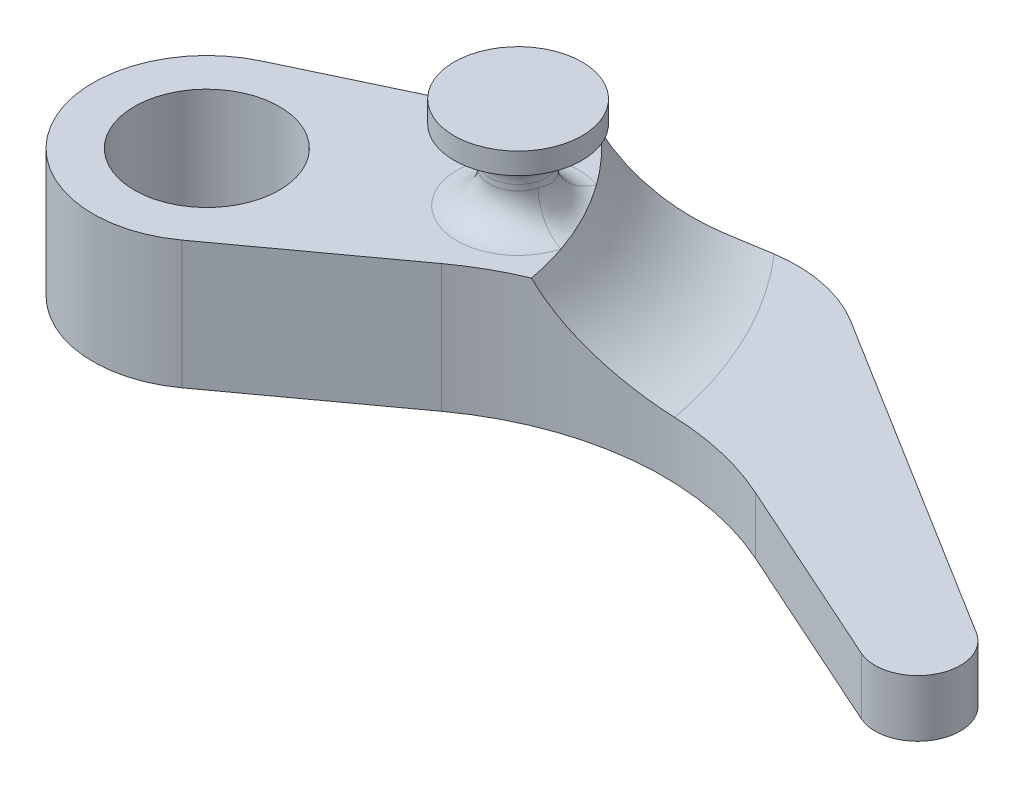
ISO-10303-21;
HEADER;
FILE_DESCRIPTION(('STEP AP214'),'2;1');
FILE_NAME('part.step','',(''),(''),'','','');
FILE_SCHEMA(('AUTOMOTIVE_DESIGN { 1 0 10303 214 1 1 1 1 }'));
ENDSEC;
DATA;
#1=APPLICATION_CONTEXT('core data for automotive mechanical design processes');
#2=APPLICATION_PROTOCOL_DEFINITION('international standard','automotive_design',2000,#1);
#3=PRODUCT_CONTEXT('',#1,'mechanical');
#4=PRODUCT('Part','Part','',(#3));
#5=PRODUCT_RELATED_PRODUCT_CATEGORY('part','',(#4));
#6=PRODUCT_DEFINITION_FORMATION('','',#4);
#7=PRODUCT_DEFINITION_CONTEXT('part definition',#1,'design');
#8=PRODUCT_DEFINITION('design','',#6,#7);
#9=PRODUCT_DEFINITION_SHAPE('','',#8);
#10=(LENGTH_UNIT() NAMED_UNIT(*) SI_UNIT(.MILLI.,.METRE.));
#11=(NAMED_UNIT(*) PLANE_ANGLE_UNIT() SI_UNIT($,.RADIAN.));
#12=(NAMED_UNIT(*) SI_UNIT($,.STERADIAN.) SOLID_ANGLE_UNIT());
#13=UNCERTAINTY_MEASURE_WITH_UNIT(LENGTH_MEASURE(1.E-05),#10,'distance_accuracy_value','');
#14=(GEOMETRIC_REPRESENTATION_CONTEXT(3) GLOBAL_UNCERTAINTY_ASSIGNED_CONTEXT((#13)) GLOBAL_UNIT_ASSIGNED_CONTEXT((#10,
#11,#12)) REPRESENTATION_CONTEXT('',''));
#15=CARTESIAN_POINT('',(0.,0.,0.));
#16=DIRECTION('',(0.,0.,1.));
#17=DIRECTION('',(1.,0.,0.));
#18=AXIS2_PLACEMENT_3D('',#15,#16,#17);
#19=CARTESIAN_POINT('',(50.,9.,0.));
#20=DIRECTION('',(0.,1.,0.));
#21=DIRECTION('',(0.,0.,1.));
#22=AXIS2_PLACEMENT_3D('',#19,#20,#21);
#23=PLANE('',#22);
#24=CARTESIAN_POINT('',(0.,9.,0.));
#25=DIRECTION('',(0.,1.,0.));
#26=DIRECTION('',(0.,0.,1.));
#27=AXIS2_PLACEMENT_3D('',#24,#25,#26);
#28=CIRCLE('',#27,5.1);
#29=CARTESIAN_POINT('',(0.,9.,5.1));
#30=VERTEX_POINT('',#29);
#31=EDGE_CURVE('E256',#30,#30,#28,.T.);
#32=ORIENTED_EDGE('',*,*,#31,.F.);
#33=EDGE_LOOP('',(#32));
#34=FACE_BOUND('',#33,.T.);
#35=CARTESIAN_POINT('',(0.,9.,0.));
#36=DIRECTION('',(0.,-1.,0.));
#37=DIRECTION('',(0.,0.,1.));
#38=AXIS2_PLACEMENT_3D('',#35,#36,#37);
#39=CIRCLE('',#38,19.6351341922937);
#40=CARTESIAN_POINT('',(18.5841220242283,9.,-6.33789423530991));
#41=VERTEX_POINT('',#40);
#42=CARTESIAN_POINT('',(19.3172991097876,9.,-3.51858634289096));
#43=VERTEX_POINT('',#42);
#44=EDGE_CURVE('E142',#41,#43,#39,.T.);
#45=ORIENTED_EDGE('',*,*,#44,.F.);
#46=CARTESIAN_POINT('',(14.4328784205439,9.,-7.45913307822854));
#47=DIRECTION('',(0.,1.,0.));
#48=DIRECTION('',(0.,0.,1.));
#49=AXIS2_PLACEMENT_3D('',#46,#47,#48);
#50=CIRCLE('',#49,4.3);
#51=CARTESIAN_POINT('',(15.9193516618392,9.,-11.4940305122302));
#52=VERTEX_POINT('',#51);
#53=EDGE_CURVE('E52',#41,#52,#50,.F.);
#54=ORIENTED_EDGE('',*,*,#53,.T.);
#55=CARTESIAN_POINT('',(12.7819439780485,9.,-14.9050462223843));
#56=VERTEX_POINT('',#55);
#57=EDGE_CURVE('E132',#56,#52,#39,.T.);
#58=ORIENTED_EDGE('',*,*,#57,.F.);
#59=DIRECTION('',(-0.903774156343791,0.,0.428009666158451));
#60=VECTOR('',#59,1.);
#61=CARTESIAN_POINT('',(-3.42407732926761,9.,-7.23019325075033));
#62=LINE('',#61,#60);
#63=CARTESIAN_POINT('',(-3.4240773292676,9.,-7.23019325075033));
#64=VERTEX_POINT('',#63);
#65=EDGE_CURVE('E134',#56,#64,#62,.T.);
#66=ORIENTED_EDGE('',*,*,#65,.T.);
#67=CARTESIAN_POINT('',(0.,9.,0.));
#68=DIRECTION('',(0.,1.,0.));
#69=DIRECTION('',(0.,0.,1.));
#70=AXIS2_PLACEMENT_3D('',#67,#68,#69);
#71=CIRCLE('',#70,8.);
#72=CARTESIAN_POINT('',(4.71284242711324,9.,6.46445018986158));
#73=VERTEX_POINT('',#72);
#74=EDGE_CURVE('E152',#64,#73,#71,.T.);
#75=ORIENTED_EDGE('',*,*,#74,.T.);
#76=DIRECTION('',(0.808056273732698,0.,-0.589105303389155));
#77=VECTOR('',#76,1.);
#78=CARTESIAN_POINT('',(4.71284242711324,9.,6.46445018986158));
#79=LINE('',#78,#77);
#80=CARTESIAN_POINT('',(15.2822849376401,9.,-1.24109562324827));
#81=VERTEX_POINT('',#80);
#82=EDGE_CURVE('E269',#73,#81,#79,.T.);
#83=ORIENTED_EDGE('',*,*,#82,.T.);
#84=CARTESIAN_POINT('',(27.0643910054231,9.,14.9200298514057));
#85=DIRECTION('',(0.,1.,0.));
#86=DIRECTION('',(0.,0.,1.));
#87=AXIS2_PLACEMENT_3D('',#84,#85,#86);
#88=CIRCLE('',#87,20.);
#89=EDGE_CURVE('E299',#81,#43,#88,.F.);
#90=ORIENTED_EDGE('',*,*,#89,.T.);
#91=EDGE_LOOP('',(#45,#54,#58,#66,#75,#83,#90));
#92=FACE_BOUND('',#91,.T.);
#93=ADVANCED_FACE('F37',(#34,#92),#23,.T.);
#94=CARTESIAN_POINT('',(24.6603959558355,9.,-8.078113187719));
#95=DIRECTION('',(0.409264418009091,0.,-0.912415824145811));
#96=DIRECTION('',(-0.912415824145811,0.,-0.409264418009091));
#97=AXIS2_PLACEMENT_3D('',#94,#95,#96);
#98=PLANE('',#97);
#99=DIRECTION('',(0.912415824145811,0.,0.409264418009091));
#100=VECTOR('',#99,1.);
#101=CARTESIAN_POINT('',(24.6603959558355,4.,-8.078113187719));
#102=LINE('',#101,#100);
#103=CARTESIAN_POINT('',(35.249679365605,4.,-3.32828663151053));
#104=VERTEX_POINT('',#103);
#105=CARTESIAN_POINT('',(48.7722067459727,4.,2.73724747243743));
#106=VERTEX_POINT('',#105);
#107=EDGE_CURVE('E139',#104,#106,#102,.T.);
#108=ORIENTED_EDGE('',*,*,#107,.F.);
#109=DIRECTION('',(0.,-1.,0.));
#110=VECTOR('',#109,1.);
#111=CARTESIAN_POINT('',(35.249679365605,0.,-3.32828663151053));
#112=LINE('',#111,#110);
#113=CARTESIAN_POINT('',(35.249679365605,0.,-3.32828663151054));
#114=VERTEX_POINT('',#113);
#115=EDGE_CURVE('E292',#104,#114,#112,.T.);
#116=ORIENTED_EDGE('',*,*,#115,.T.);
#117=DIRECTION('',(0.912415824145811,0.,0.409264418009091));
#118=VECTOR('',#117,1.);
#119=CARTESIAN_POINT('',(24.6603959558355,0.,-8.078113187719));
#120=LINE('',#119,#118);
#121=CARTESIAN_POINT('',(48.7722067459727,0.,2.73724747243744));
#122=VERTEX_POINT('',#121);
#123=EDGE_CURVE('E257',#114,#122,#120,.T.);
#124=ORIENTED_EDGE('',*,*,#123,.T.);
#125=DIRECTION('',(0.,-1.,0.));
#126=VECTOR('',#125,1.);
#127=CARTESIAN_POINT('',(48.7722067459727,9.,2.73724747243744));
#128=LINE('',#127,#126);
#129=EDGE_CURVE('E289',#106,#122,#128,.T.);
#130=ORIENTED_EDGE('',*,*,#129,.F.);
#131=EDGE_LOOP('',(#108,#116,#124,#130));
#132=FACE_BOUND('',#131,.T.);
#133=ADVANCED_FACE('F247',(#132),#98,.F.);
#134=CARTESIAN_POINT('',(50.,9.,0.));
#135=DIRECTION('',(0.,-1.,0.));
#136=DIRECTION('',(0.,0.,-1.));
#137=AXIS2_PLACEMENT_3D('',#134,#135,#136);
#138=CYLINDRICAL_SURFACE('',#137,3.);
#139=CARTESIAN_POINT('',(50.,4.,0.));
#140=DIRECTION('',(0.,1.,0.));
#141=DIRECTION('',(0.,0.,1.));
#142=AXIS2_PLACEMENT_3D('',#139,#140,#141);
#143=CIRCLE('',#142,3.);
#144=CARTESIAN_POINT('',(51.585093155393,4.,-2.54705313818267));
#145=VERTEX_POINT('',#144);
#146=EDGE_CURVE('E333',#106,#145,#143,.T.);
#147=ORIENTED_EDGE('',*,*,#146,.F.);
#148=ORIENTED_EDGE('',*,*,#129,.T.);
#149=CARTESIAN_POINT('',(50.,0.,0.));
#150=DIRECTION('',(0.,1.,0.));
#151=DIRECTION('',(0.,0.,1.));
#152=AXIS2_PLACEMENT_3D('',#149,#150,#151);
#153=CIRCLE('',#152,3.);
#154=CARTESIAN_POINT('',(51.585093155393,0.,-2.54705313818268));
#155=VERTEX_POINT('',#154);
#156=EDGE_CURVE('E260',#122,#155,#153,.T.);
#157=ORIENTED_EDGE('',*,*,#156,.T.);
#158=DIRECTION('',(0.,-1.,0.));
#159=VECTOR('',#158,1.);
#160=CARTESIAN_POINT('',(51.585093155393,9.,-2.54705313818268));
#161=LINE('',#160,#159);
#162=EDGE_CURVE('E287',#145,#155,#161,.T.);
#163=ORIENTED_EDGE('',*,*,#162,.F.);
#164=EDGE_LOOP('',(#147,#148,#157,#163));
#165=FACE_BOUND('',#164,.T.);
#166=ADVANCED_FACE('F252',(#165),#138,.T.);
#167=CARTESIAN_POINT('',(23.5403167814108,9.,-20.));
#168=DIRECTION('',(-0.528364385131008,0.,0.849017712727557));
#169=DIRECTION('',(0.849017712727557,0.,0.528364385131008));
#170=AXIS2_PLACEMENT_3D('',#167,#168,#169);
#171=PLANE('',#170);
#172=DIRECTION('',(-0.849017712727557,0.,-0.528364385131008));
#173=VECTOR('',#172,1.);
#174=CARTESIAN_POINT('',(23.5403167814108,0.,-20.));
#175=LINE('',#174,#173);
#176=CARTESIAN_POINT('',(28.17280352365,0.,-17.1170907597117));
#177=VERTEX_POINT('',#176);
#178=EDGE_CURVE('E275',#155,#177,#175,.T.);
#179=ORIENTED_EDGE('',*,*,#178,.T.);
#180=DIRECTION('',(0.,-1.,0.));
#181=VECTOR('',#180,1.);
#182=CARTESIAN_POINT('',(28.17280352365,9.,-17.1170907597117));
#183=LINE('',#182,#181);
#184=CARTESIAN_POINT('',(28.17280352365,4.,-17.1170907597117));
#185=VERTEX_POINT('',#184);
#186=EDGE_CURVE('E308',#177,#185,#183,.F.);
#187=ORIENTED_EDGE('',*,*,#186,.T.);
#188=DIRECTION('',(-0.849017712727557,0.,-0.528364385131008));
#189=VECTOR('',#188,1.);
#190=CARTESIAN_POINT('',(23.5403167814108,4.,-20.));
#191=LINE('',#190,#189);
#192=EDGE_CURVE('E263',#145,#185,#191,.T.);
#193=ORIENTED_EDGE('',*,*,#192,.F.);
#194=ORIENTED_EDGE('',*,*,#162,.T.);
#195=EDGE_LOOP('',(#179,#187,#193,#194));
#196=FACE_BOUND('',#195,.T.);
#197=ADVANCED_FACE('F398',(#196),#171,.F.);
#198=CARTESIAN_POINT('',(50.,0.,0.));
#199=DIRECTION('',(0.,1.,0.));
#200=DIRECTION('',(0.,0.,1.));
#201=AXIS2_PLACEMENT_3D('',#198,#199,#200);
#202=PLANE('',#201);
#203=DIRECTION('',(-0.903774156343791,0.,0.428009666158451));
#204=VECTOR('',#203,1.);
#205=CARTESIAN_POINT('',(-3.42407732926761,0.,-7.23019325075033));
#206=LINE('',#205,#204);
#207=CARTESIAN_POINT('',(18.6090630107554,0.,-17.664655195874));
#208=VERTEX_POINT('',#207);
#209=CARTESIAN_POINT('',(-3.4240773292676,0.,-7.23019325075033));
#210=VERTEX_POINT('',#209);
#211=EDGE_CURVE('E278',#208,#210,#206,.T.);
#212=ORIENTED_EDGE('',*,*,#211,.F.);
#213=CARTESIAN_POINT('',(22.8891596723399,0.,-8.6269136324361));
#214=DIRECTION('',(0.,1.,0.));
#215=DIRECTION('',(0.,0.,1.));
#216=AXIS2_PLACEMENT_3D('',#213,#214,#215);
#217=CIRCLE('',#216,10.);
#218=EDGE_CURVE('E306',#208,#177,#217,.F.);
#219=ORIENTED_EDGE('',*,*,#218,.T.);
#220=ORIENTED_EDGE('',*,*,#178,.F.);
#221=ORIENTED_EDGE('',*,*,#156,.F.);
#222=ORIENTED_EDGE('',*,*,#123,.F.);
#223=CARTESIAN_POINT('',(27.0643910054231,0.,14.9200298514057));
#224=DIRECTION('',(0.,1.,0.));
#225=DIRECTION('',(0.,0.,1.));
#226=AXIS2_PLACEMENT_3D('',#223,#224,#225);
#227=CIRCLE('',#226,20.);
#228=CARTESIAN_POINT('',(15.2822849376401,0.,-1.24109562324827));
#229=VERTEX_POINT('',#228);
#230=EDGE_CURVE('E297',#114,#229,#227,.T.);
#231=ORIENTED_EDGE('',*,*,#230,.T.);
#232=DIRECTION('',(0.808056273732698,0.,-0.589105303389155));
#233=VECTOR('',#232,1.);
#234=CARTESIAN_POINT('',(4.71284242711324,0.,6.46445018986158));
#235=LINE('',#234,#233);
#236=CARTESIAN_POINT('',(4.71284242711324,0.,6.46445018986158));
#237=VERTEX_POINT('',#236);
#238=EDGE_CURVE('E153',#237,#229,#235,.T.);
#239=ORIENTED_EDGE('',*,*,#238,.F.);
#240=CARTESIAN_POINT('',(0.,0.,0.));
#241=DIRECTION('',(0.,1.,0.));
#242=DIRECTION('',(0.,0.,1.));
#243=AXIS2_PLACEMENT_3D('',#240,#241,#242);
#244=CIRCLE('',#243,8.);
#245=EDGE_CURVE('E280',#210,#237,#244,.T.);
#246=ORIENTED_EDGE('',*,*,#245,.F.);
#247=EDGE_LOOP('',(#212,#219,#220,#221,#222,#231,#239,#246));
#248=FACE_BOUND('',#247,.T.);
#249=CARTESIAN_POINT('',(0.,0.,0.));
#250=DIRECTION('',(0.,1.,0.));
#251=DIRECTION('',(0.,0.,1.));
#252=AXIS2_PLACEMENT_3D('',#249,#250,#251);
#253=CIRCLE('',#252,5.1);
#254=CARTESIAN_POINT('',(0.,0.,5.1));
#255=VERTEX_POINT('',#254);
#256=EDGE_CURVE('E258',#255,#255,#253,.T.);
#257=ORIENTED_EDGE('',*,*,#256,.T.);
#258=EDGE_LOOP('',(#257));
#259=FACE_BOUND('',#258,.T.);
#260=ADVANCED_FACE('F326',(#248,#259),#202,.F.);
#261=CARTESIAN_POINT('',(-3.42407732926761,9.,-7.23019325075033));
#262=DIRECTION('',(0.428009666158451,0.,0.903774156343791));
#263=DIRECTION('',(0.903774156343791,0.,-0.428009666158451));
#264=AXIS2_PLACEMENT_3D('',#261,#262,#263);
#265=PLANE('',#264);
#266=ORIENTED_EDGE('',*,*,#65,.F.);
#267=CARTESIAN_POINT('',(12.7819439780485,9.,-14.9050462223843));
#268=CARTESIAN_POINT('',(12.9265925091345,8.74680657867576,-14.9735489219424));
#269=CARTESIAN_POINT('',(13.0814721341331,8.50084613002611,-15.0468968663654));
#270=CARTESIAN_POINT('',(13.4099345318748,8.02486186234918,-15.2024501981532));
#271=CARTESIAN_POINT('',(13.5835099647121,7.79483184694503,-15.2846521094831));
#272=CARTESIAN_POINT('',(13.9476720807586,7.35203807927803,-15.4571121257632));
#273=CARTESIAN_POINT('',(14.1382542044342,7.13926972815401,-15.5473680714081));
#274=CARTESIAN_POINT('',(14.5348232287598,6.73208729753039,-15.7351753621111));
#275=CARTESIAN_POINT('',(14.7408111082856,6.537674386107,-15.8327271707457));
#276=CARTESIAN_POINT('',(15.1662789420027,6.16851803264646,-16.0342203692314));
#277=CARTESIAN_POINT('',(15.3857414395889,5.99374993841039,-16.1381534919776));
#278=CARTESIAN_POINT('',(15.8368150176805,5.66454365185223,-16.3517730674177));
#279=CARTESIAN_POINT('',(16.0684273161736,5.51010750322512,-16.4614600969266));
#280=CARTESIAN_POINT('',(16.5418116484501,5.22268860207377,-16.685645606769));
#281=CARTESIAN_POINT('',(16.7835677549537,5.0896736950131,-16.800136544256));
#282=CARTESIAN_POINT('',(17.2758825613222,4.84566103030158,-17.0332871543278));
#283=CARTESIAN_POINT('',(17.5264369579603,4.73465268108636,-17.1519447889889));
#284=CARTESIAN_POINT('',(17.9168400373539,4.58155710376218,-17.3368320094362));
#285=CARTESIAN_POINT('',(18.0541400905092,4.5313824957229,-17.4018546143669));
#286=CARTESIAN_POINT('',(18.3303824878247,4.4377100471281,-17.5326775809497));
#287=CARTESIAN_POINT('',(18.4693223270281,4.39420316225841,-17.5984767563036));
#288=CARTESIAN_POINT('',(18.6090630107554,4.35403577340383,-17.664655195874));
#289=B_SPLINE_CURVE_WITH_KNOTS('',3,(#267,#268,#269,#270,#271,#272,#273,#274,#275,#276,#277,
#278,#279,#280,#281,#282,#283,#284,#285,#286,#287,#288),.UNSPECIFIED.,.F.,.F.,(4,2,2,2,2,2,2,2,
2,2,4),(0.,0.898219489125047,1.79608761712054,2.6937157436815,3.59140095372184,4.4879467804026,
5.38458265599361,6.27985982457269,7.1747050523287,7.65454258345187,8.13372337440446),.UNSPECIFIED.);
#290=CARTESIAN_POINT('',(18.6090630107554,4.35403577340383,-17.664655195874));
#291=VERTEX_POINT('',#290);
#292=EDGE_CURVE('E147',#56,#291,#289,.T.);
#293=ORIENTED_EDGE('',*,*,#292,.T.);
#294=DIRECTION('',(0.,-1.,0.));
#295=VECTOR('',#294,1.);
#296=CARTESIAN_POINT('',(18.6090630107554,9.,-17.664655195874));
#297=LINE('',#296,#295);
#298=EDGE_CURVE('E304',#291,#208,#297,.T.);
#299=ORIENTED_EDGE('',*,*,#298,.T.);
#300=ORIENTED_EDGE('',*,*,#211,.T.);
#301=DIRECTION('',(0.,-1.,0.));
#302=VECTOR('',#301,1.);
#303=CARTESIAN_POINT('',(-3.4240773292676,9.,-7.23019325075033));
#304=LINE('',#303,#302);
#305=EDGE_CURVE('E150',#64,#210,#304,.T.);
#306=ORIENTED_EDGE('',*,*,#305,.F.);
#307=EDGE_LOOP('',(#266,#293,#299,#300,#306));
#308=FACE_BOUND('',#307,.T.);
#309=ADVANCED_FACE('F145',(#308),#265,.F.);
#310=CARTESIAN_POINT('',(0.,9.,0.));
#311=DIRECTION('',(0.,-1.,0.));
#312=DIRECTION('',(0.,0.,-1.));
#313=AXIS2_PLACEMENT_3D('',#310,#311,#312);
#314=CYLINDRICAL_SURFACE('',#313,8.);
#315=ORIENTED_EDGE('',*,*,#245,.T.);
#316=DIRECTION('',(0.,-1.,0.));
#317=VECTOR('',#316,1.);
#318=CARTESIAN_POINT('',(4.71284242711324,9.,6.46445018986158));
#319=LINE('',#318,#317);
#320=EDGE_CURVE('E271',#73,#237,#319,.T.);
#321=ORIENTED_EDGE('',*,*,#320,.F.);
#322=ORIENTED_EDGE('',*,*,#74,.F.);
#323=ORIENTED_EDGE('',*,*,#305,.T.);
#324=EDGE_LOOP('',(#315,#321,#322,#323));
#325=FACE_BOUND('',#324,.T.);
#326=ADVANCED_FACE('F241',(#325),#314,.T.);
#327=CARTESIAN_POINT('',(4.71284242711324,9.,6.46445018986158));
#328=DIRECTION('',(-0.589105303389154,0.,-0.808056273732698));
#329=DIRECTION('',(-0.808056273732698,0.,0.589105303389154));
#330=AXIS2_PLACEMENT_3D('',#327,#328,#329);
#331=PLANE('',#330);
#332=ORIENTED_EDGE('',*,*,#238,.T.);
#333=DIRECTION('',(0.,-1.,0.));
#334=VECTOR('',#333,1.);
#335=CARTESIAN_POINT('',(15.2822849376401,4.,-1.24109562324826));
#336=LINE('',#335,#334);
#337=EDGE_CURVE('E295',#229,#81,#336,.F.);
#338=ORIENTED_EDGE('',*,*,#337,.T.);
#339=ORIENTED_EDGE('',*,*,#82,.F.);
#340=ORIENTED_EDGE('',*,*,#320,.T.);
#341=EDGE_LOOP('',(#332,#338,#339,#340));
#342=FACE_BOUND('',#341,.T.);
#343=ADVANCED_FACE('F236',(#342),#331,.F.);
#344=CARTESIAN_POINT('',(0.,9.,0.));
#345=DIRECTION('',(0.,-1.,0.));
#346=DIRECTION('',(0.,0.,-1.));
#347=AXIS2_PLACEMENT_3D('',#344,#345,#346);
#348=CYLINDRICAL_SURFACE('',#347,5.1);
#349=ORIENTED_EDGE('',*,*,#31,.T.);
#350=EDGE_LOOP('',(#349));
#351=FACE_BOUND('',#350,.T.);
#352=ORIENTED_EDGE('',*,*,#256,.F.);
#353=EDGE_LOOP('',(#352));
#354=FACE_BOUND('',#353,.T.);
#355=ADVANCED_FACE('F233',(#351,#354),#348,.F.);
#356=CARTESIAN_POINT('',(0.,4.,0.));
#357=DIRECTION('',(0.,1.,0.));
#358=DIRECTION('',(0.,0.,1.));
#359=AXIS2_PLACEMENT_3D('',#356,#357,#358);
#360=PLANE('',#359);
#361=CARTESIAN_POINT('',(22.8891596723399,4.,-8.6269136324361));
#362=DIRECTION('',(0.,1.,0.));
#363=DIRECTION('',(0.,0.,1.));
#364=AXIS2_PLACEMENT_3D('',#361,#362,#363);
#365=CIRCLE('',#364,10.);
#366=CARTESIAN_POINT('',(21.3968686502042,4.,-18.5149401041469));
#367=VERTEX_POINT('',#366);
#368=EDGE_CURVE('E310',#185,#367,#365,.T.);
#369=ORIENTED_EDGE('',*,*,#368,.T.);
#370=CARTESIAN_POINT('',(0.,4.,0.));
#371=DIRECTION('',(0.,1.,0.));
#372=DIRECTION('',(0.,0.,1.));
#373=AXIS2_PLACEMENT_3D('',#370,#371,#372);
#374=CIRCLE('',#373,28.2953882301381);
#375=CARTESIAN_POINT('',(27.8383707748396,4.,-5.06498842020303));
#376=VERTEX_POINT('',#375);
#377=EDGE_CURVE('E163',#367,#376,#374,.F.);
#378=ORIENTED_EDGE('',*,*,#377,.T.);
#379=CARTESIAN_POINT('',(27.0643910054231,4.,14.9200298514057));
#380=DIRECTION('',(0.,1.,0.));
#381=DIRECTION('',(0.,0.,1.));
#382=AXIS2_PLACEMENT_3D('',#379,#380,#381);
#383=CIRCLE('',#382,20.);
#384=EDGE_CURVE('E302',#376,#104,#383,.F.);
#385=ORIENTED_EDGE('',*,*,#384,.T.);
#386=ORIENTED_EDGE('',*,*,#107,.T.);
#387=ORIENTED_EDGE('',*,*,#146,.T.);
#388=ORIENTED_EDGE('',*,*,#192,.T.);
#389=EDGE_LOOP('',(#369,#378,#385,#386,#387,#388));
#390=FACE_BOUND('',#389,.T.);
#391=ADVANCED_FACE('F229',(#390),#360,.T.);
#392=CARTESIAN_POINT('',(27.0643910054231,9.,14.9200298514057));
#393=DIRECTION('',(0.,1.,0.));
#394=DIRECTION('',(0.,0.,1.));
#395=AXIS2_PLACEMENT_3D('',#392,#393,#394);
#396=CYLINDRICAL_SURFACE('',#395,20.);
#397=ORIENTED_EDGE('',*,*,#89,.F.);
#398=ORIENTED_EDGE('',*,*,#337,.F.);
#399=ORIENTED_EDGE('',*,*,#230,.F.);
#400=ORIENTED_EDGE('',*,*,#115,.F.);
#401=ORIENTED_EDGE('',*,*,#384,.F.);
#402=CARTESIAN_POINT('',(27.8383707748396,4.,-5.06498842020303));
#403=CARTESIAN_POINT('',(27.5808998367106,3.99996603360385,-5.07500345163974));
#404=CARTESIAN_POINT('',(27.3232140492119,4.00948834518667,-5.07995788059808));
#405=CARTESIAN_POINT('',(26.8092771047482,4.04783021143104,-5.07998224431851));
#406=CARTESIAN_POINT('',(26.5530259873394,4.07665029554742,-5.07505190787417));
#407=CARTESIAN_POINT('',(26.044509276921,4.15367059953575,-5.05556868368567));
#408=CARTESIAN_POINT('',(25.7922349470479,4.20181944721716,-5.04104123767649));
#409=CARTESIAN_POINT('',(25.2928604530678,4.31741269371456,-5.00293059873405));
#410=CARTESIAN_POINT('',(25.0457599841434,4.38485595235047,-4.97934794087951));
#411=CARTESIAN_POINT('',(24.5583138989335,4.53881447881014,-4.92385614303385));
#412=CARTESIAN_POINT('',(24.3179739239407,4.62534517122231,-4.8919402651));
#413=CARTESIAN_POINT('',(23.8459224068755,4.81694776459398,-4.82075137542927));
#414=CARTESIAN_POINT('',(23.6142113048258,4.92202060953272,-4.78147798911607));
#415=CARTESIAN_POINT('',(23.1608616884651,5.15005304552729,-4.69668917167735));
#416=CARTESIAN_POINT('',(22.9392267070492,5.27301884770336,-4.65117157333551));
#417=CARTESIAN_POINT('',(22.5074408020999,5.53596136411259,-4.55516276709521));
#418=CARTESIAN_POINT('',(22.2972896551093,5.67593774717563,-4.50467165602709));
#419=CARTESIAN_POINT('',(21.8870311369127,5.973803462128,-4.39939978665707));
#420=CARTESIAN_POINT('',(21.6870827737466,6.13189542262884,-4.3445731735217));
#421=CARTESIAN_POINT('',(21.3010751460209,6.46347281046126,-4.23263530955442));
#422=CARTESIAN_POINT('',(21.1150162766293,6.63695867545546,-4.1755239937917));
#423=CARTESIAN_POINT('',(20.7577017227526,6.99810006852257,-4.06050978668469));
#424=CARTESIAN_POINT('',(20.5864378920357,7.18574769102308,-4.00260735154055));
#425=CARTESIAN_POINT('',(20.2593259575074,7.57410062882385,-3.8874459660291));
#426=CARTESIAN_POINT('',(20.1034723253035,7.77480121823625,-3.83018679147498));
#427=CARTESIAN_POINT('',(19.8390385567136,8.14436295302218,-3.72963087423642));
#428=CARTESIAN_POINT('',(19.7274364530427,8.31096701676984,-3.68594498833865));
#429=CARTESIAN_POINT('',(19.5146103169917,8.65067789162205,-3.60060455546759));
#430=CARTESIAN_POINT('',(19.4133654031153,8.82377061726934,-3.55894601375224));
#431=CARTESIAN_POINT('',(19.3172991097876,9.,-3.51858634289096));
#432=B_SPLINE_CURVE_WITH_KNOTS('',3,(#402,#403,#404,#405,#406,#407,#408,#409,#410,#411,#412,
#413,#414,#415,#416,#417,#418,#419,#420,#421,#422,#423,#424,#425,#426,#427,#428,#429,#430,#431),
.UNSPECIFIED.,.F.,.F.,(4,2,2,2,2,2,2,2,2,2,2,2,2,2,4),(0.,0.772798593524394,1.54561839046614,
2.31639763580591,3.08713134227539,3.85849017669146,4.62988829224822,5.40155482218855,
6.17320633136232,6.95453497965837,7.73588584895619,8.5168037229209,9.29744041913782,
9.9127764383449,10.5268463379039),.UNSPECIFIED.);
#433=EDGE_CURVE('E158',#376,#43,#432,.T.);
#434=ORIENTED_EDGE('',*,*,#433,.T.);
#435=EDGE_LOOP('',(#397,#398,#399,#400,#401,#434));
#436=FACE_BOUND('',#435,.T.);
#437=ADVANCED_FACE('F232',(#436),#396,.F.);
#438=CARTESIAN_POINT('',(22.8891596723399,9.,-8.6269136324361));
#439=DIRECTION('',(0.,-1.,0.));
#440=DIRECTION('',(0.,0.,-1.));
#441=AXIS2_PLACEMENT_3D('',#438,#439,#440);
#442=CYLINDRICAL_SURFACE('',#441,10.);
#443=ORIENTED_EDGE('',*,*,#368,.F.);
#444=ORIENTED_EDGE('',*,*,#186,.F.);
#445=ORIENTED_EDGE('',*,*,#218,.F.);
#446=ORIENTED_EDGE('',*,*,#298,.F.);
#447=CARTESIAN_POINT('',(18.6090630107554,4.35403577340383,-17.664655195874));
#448=CARTESIAN_POINT('',(18.7172604148511,4.32293290297612,-17.7158985690146));
#449=CARTESIAN_POINT('',(18.8268754078138,4.29401647120803,-17.7654273343536));
#450=CARTESIAN_POINT('',(19.048698868768,4.24046932456896,-17.8608418038729));
#451=CARTESIAN_POINT('',(19.1609071778616,4.21583834790385,-17.9067277304973));
#452=CARTESIAN_POINT('',(19.4989185175716,4.14866706111049,-18.0377717562231));
#453=CARTESIAN_POINT('',(19.72817940507,4.11225977768138,-18.1173000481181));
#454=CARTESIAN_POINT('',(20.1936341650621,4.05498805814757,-18.2598464922441));
#455=CARTESIAN_POINT('',(20.429827817393,4.03412312902011,-18.3228651681396));
#456=CARTESIAN_POINT('',(20.7887394525936,4.01348345135883,-18.4046182928999));
#457=CARTESIAN_POINT('',(20.9097336748928,4.0083814181134,-18.4298291433468));
#458=CARTESIAN_POINT('',(21.1526563744483,4.00163982935273,-18.4757631687628));
#459=CARTESIAN_POINT('',(21.2745847674128,3.9999999650482,-18.496486743802));
#460=CARTESIAN_POINT('',(21.3968686502042,4.,-18.5149401041469));
#461=B_SPLINE_CURVE_WITH_KNOTS('',3,(#447,#448,#449,#450,#451,#452,#453,#454,#455,#456,#457,
#458,#459,#460),.UNSPECIFIED.,.F.,.F.,(4,2,2,2,2,2,4),(0.,0.371000650368669,0.741978628718646,
1.47686394521826,2.21172594925165,2.58270389447987,2.95364875095426),.UNSPECIFIED.);
#462=EDGE_CURVE('E157',#291,#367,#461,.T.);
#463=ORIENTED_EDGE('',*,*,#462,.T.);
#464=EDGE_LOOP('',(#443,#444,#445,#446,#463));
#465=FACE_BOUND('',#464,.T.);
#466=ADVANCED_FACE('F190',(#465),#442,.T.);
#467=CARTESIAN_POINT('',(0.,14.,0.));
#468=DIRECTION('',(0.,1.,0.));
#469=DIRECTION('',(0.,0.,1.));
#470=AXIS2_PLACEMENT_3D('',#467,#468,#469);
#471=TOROIDAL_SURFACE('',#470,28.2953882301381,10.);
#472=ORIENTED_EDGE('',*,*,#292,.F.);
#473=ORIENTED_EDGE('',*,*,#57,.T.);
#474=EDGE_CURVE('E140',#52,#41,#39,.T.);
#475=ORIENTED_EDGE('',*,*,#474,.T.);
#476=ORIENTED_EDGE('',*,*,#44,.T.);
#477=ORIENTED_EDGE('',*,*,#433,.F.);
#478=ORIENTED_EDGE('',*,*,#377,.F.);
#479=ORIENTED_EDGE('',*,*,#462,.F.);
#480=EDGE_LOOP('',(#472,#473,#475,#476,#477,#478,#479));
#481=FACE_BOUND('',#480,.T.);
#482=ADVANCED_FACE('F155',(#481),#471,.F.);
#483=CARTESIAN_POINT('',(14.4328784205439,14.,-7.45913307822854));
#484=DIRECTION('',(0.,-1.,0.));
#485=DIRECTION('',(0.,0.,-1.));
#486=AXIS2_PLACEMENT_3D('',#483,#484,#485);
#487=CYLINDRICAL_SURFACE('',#486,2.);
#488=CARTESIAN_POINT('',(14.4328784205439,11.3,-7.45913307822854));
#489=DIRECTION('',(0.,1.,0.));
#490=DIRECTION('',(0.,0.,1.));
#491=AXIS2_PLACEMENT_3D('',#488,#489,#490);
#492=CIRCLE('',#491,2.);
#493=CARTESIAN_POINT('',(15.1242613234719,11.3,-9.33582955915954));
#494=VERTEX_POINT('',#493);
#495=CARTESIAN_POINT('',(16.3636893990017,11.3,-6.93762663966174));
#496=VERTEX_POINT('',#495);
#497=EDGE_CURVE('E221',#494,#496,#492,.T.);
#498=ORIENTED_EDGE('',*,*,#497,.T.);
#499=CARTESIAN_POINT('',(15.2898631633714,9.,-12.3190332086069));
#500=CARTESIAN_POINT('',(15.4160186902241,8.27231661608342,-9.42424299453832));
#501=CARTESIAN_POINT('',(14.5065697489936,11.117844147949,-9.45777501417188));
#502=CARTESIAN_POINT('',(15.3174939127558,9.,-12.2847401022045));
#503=CARTESIAN_POINT('',(15.3741593265836,8.303551263891,-9.41227659073421));
#504=CARTESIAN_POINT('',(14.5363658474353,11.1383471584292,-9.45668044209487));
#505=CARTESIAN_POINT('',(15.3457836506777,9.,-12.2493908965778));
#506=CARTESIAN_POINT('',(15.3360779476099,8.33733059889801,-9.40250176000281));
#507=CARTESIAN_POINT('',(14.566431356877,11.1567558167778,-9.45490051852947));
#508=CARTESIAN_POINT('',(15.4034729229387,9.,-12.1767671963456));
#509=CARTESIAN_POINT('',(15.2685979666997,8.40783758655986,-9.38652242177463));
#510=CARTESIAN_POINT('',(14.6268729454606,11.1897106303993,-9.44993216421952));
#511=CARTESIAN_POINT('',(15.4328713740004,9.,-12.1394945685567));
#512=CARTESIAN_POINT('',(15.2391001985273,8.4444884557279,-9.38027170687262));
#513=CARTESIAN_POINT('',(14.65724870134,11.204260449749,-9.44674507733624));
#514=CARTESIAN_POINT('',(15.5221701896226,9.,-12.0253905767233));
#515=CARTESIAN_POINT('',(15.1647392117697,8.55514065705248,-9.36546576892768));
#516=CARTESIAN_POINT('',(14.7482505063996,11.2425211544443,-9.43505451743723));
#517=CARTESIAN_POINT('',(15.5834820304472,9.,-11.9458923594275));
#518=CARTESIAN_POINT('',(15.1317851899548,8.63159408863293,-9.36033304512264));
#519=CARTESIAN_POINT('',(14.8090832828756,11.2610610816465,-9.42441048349465));
#520=CARTESIAN_POINT('',(15.7412772105504,9.,-11.737779657367));
#521=CARTESIAN_POINT('',(15.0890523997537,8.81652151465585,-9.34985220946852));
#522=CARTESIAN_POINT('',(14.9616052799432,11.2939265859096,-9.39028224028649));
#523=CARTESIAN_POINT('',(15.8393724909057,9.,-11.6052367568168));
#524=CARTESIAN_POINT('',(15.0973276011656,8.92331781119273,-9.34552332668701));
#525=CARTESIAN_POINT('',(15.0527791028576,11.3009669222312,-9.36299335573767));
#526=CARTESIAN_POINT('',(16.0380524785741,9.,-11.3290990140929));
#527=CARTESIAN_POINT('',(15.1619323883736,9.10947885210101,-9.32222607321736));
#528=CARTESIAN_POINT('',(15.230456709726,11.2988203583348,-9.29569439473214));
#529=CARTESIAN_POINT('',(16.1386446774154,9.,-11.185467224913));
#530=CARTESIAN_POINT('',(15.216654152925,9.19017934538268,-9.30374074062384));
#531=CARTESIAN_POINT('',(15.3169430899171,11.2895767551958,-9.25564026592754));
#532=CARTESIAN_POINT('',(16.3418432802835,9.,-10.8865035389625));
#533=CARTESIAN_POINT('',(15.3508046207327,9.32536940655105,-9.24412894416736));
#534=CARTESIAN_POINT('',(15.48470623651,11.2625572348373,-9.16295782619375));
#535=CARTESIAN_POINT('',(16.4444514097161,9.,-10.7310004027136));
#536=CARTESIAN_POINT('',(15.4303218630045,9.38071994613126,-9.20313923530565));
#537=CARTESIAN_POINT('',(15.5658517209032,11.2446215042765,-9.11010366578747));
#538=CARTESIAN_POINT('',(16.6482161944769,9.,-10.4120677253872));
#539=CARTESIAN_POINT('',(15.5954701398249,9.46864027588573,-9.09726277500707));
#540=CARTESIAN_POINT('',(15.7196087789709,11.2073543022276,-8.99328952282804));
#541=CARTESIAN_POINT('',(16.7493734412311,9.,-10.2486415402813));
#542=CARTESIAN_POINT('',(15.6815369372669,9.50212274681382,-9.03261896245485));
#543=CARTESIAN_POINT('',(15.7922239219968,11.1880234200184,-8.92933421328368));
#544=CARTESIAN_POINT('',(16.9072426036579,9.,-9.9848131985208));
#545=CARTESIAN_POINT('',(15.8133348995236,9.54215773458108,-8.91326010780493));
#546=CARTESIAN_POINT('',(15.8992934176744,11.161010040438,-8.82030835185322));
#547=CARTESIAN_POINT('',(16.9648905733219,9.,-9.8865618339264));
#548=CARTESIAN_POINT('',(15.8608390685995,9.55416793629918,-8.86585424009193));
#549=CARTESIAN_POINT('',(15.9370296269551,11.1518324369874,-8.77849046743129));
#550=CARTESIAN_POINT('',(17.0790050135107,9.,-9.68809403230416));
#551=CARTESIAN_POINT('',(15.9521587478638,9.57361343890613,-8.76478838801432));
#552=CARTESIAN_POINT('',(16.0088818096398,11.135913230319,-8.69176465252724));
#553=CARTESIAN_POINT('',(17.1354718529105,9.,-9.58787822831249));
#554=CARTESIAN_POINT('',(15.9961315629845,9.58111157097312,-8.7110343268119));
#555=CARTESIAN_POINT('',(16.0429989272835,11.1291708555297,-8.64685770615325));
#556=CARTESIAN_POINT('',(17.2469594532049,9.,-9.38585088531022));
#557=CARTESIAN_POINT('',(16.0789804907387,9.59221764858151,-8.59832890325331));
#558=CARTESIAN_POINT('',(16.1073453984457,11.1188039902606,-8.55427617657296));
#559=CARTESIAN_POINT('',(17.3019804171059,9.,-9.28403957355387));
#560=CARTESIAN_POINT('',(16.1180006305374,9.59585986462643,-8.5392382109173));
#561=CARTESIAN_POINT('',(16.1375753000892,11.1151790597883,-8.5066019849469));
#562=CARTESIAN_POINT('',(17.4103258493976,9.,-9.0792328106943));
#563=CARTESIAN_POINT('',(16.1898984860064,9.59963168439842,-8.41713464021758));
#564=CARTESIAN_POINT('',(16.1939073014581,11.1114086033952,-8.4088484277349));
#565=CARTESIAN_POINT('',(17.4636504278585,9.,-8.97623743701196));
#566=CARTESIAN_POINT('',(16.2228923256155,9.59977267495062,-8.35394837161091));
#567=CARTESIAN_POINT('',(16.2200096694375,11.1112628512656,-8.35876921873036));
#568=CARTESIAN_POINT('',(17.566297071887,9.,-8.77360139465295));
#569=CARTESIAN_POINT('',(16.2808427825626,9.59663900947675,-8.2276514499241));
#570=CARTESIAN_POINT('',(16.2669314475096,11.1144044809272,-8.25862303443747));
#571=CARTESIAN_POINT('',(17.6156940267855,9.,-8.67398914445196));
#572=CARTESIAN_POINT('',(16.3061379651344,9.59349068126809,-8.16445809144527));
#573=CARTESIAN_POINT('',(16.287918963447,11.1175563163714,-8.20863390227366));
#574=CARTESIAN_POINT('',(17.7125363204162,9.,-8.47448366072012));
#575=CARTESIAN_POINT('',(16.3500986889739,9.58372083080547,-8.0371838069904));
#576=CARTESIAN_POINT('',(16.3257576168109,11.1267781410298,-8.10716494859499));
#577=CARTESIAN_POINT('',(17.7599809573466,9.,-8.37459033970267));
#578=CARTESIAN_POINT('',(16.3687944405936,9.57707084307839,-7.97292711194495));
#579=CARTESIAN_POINT('',(16.342607277426,11.1328491698318,-8.05568460216905));
#580=CARTESIAN_POINT('',(17.8992364673717,9.,-8.07491440811105));
#581=CARTESIAN_POINT('',(16.4148922269734,9.55102597996525,-7.78036596416907));
#582=CARTESIAN_POINT('',(16.3867979720231,11.1546749234111,-7.89946657500079));
#583=CARTESIAN_POINT('',(17.9879555217766,9.,-7.87516236019531));
#584=CARTESIAN_POINT('',(16.431929496775,9.5253908460704,-7.65257406253432));
#585=CARTESIAN_POINT('',(16.407774555532,11.1740416622044,-7.79296510693973));
#586=CARTESIAN_POINT('',(18.1573195704131,9.,-7.47648501125885));
#587=CARTESIAN_POINT('',(16.4427143826475,9.45139525815116,-7.41221054885314));
#588=CARTESIAN_POINT('',(16.4324118353369,11.2156740970402,-7.57686731144137));
#589=CARTESIAN_POINT('',(18.2378545179111,9.,-7.27759860640108));
#590=CARTESIAN_POINT('',(16.4356330430633,9.40181961671753,-7.29905903437126));
#591=CARTESIAN_POINT('',(16.4358610525958,11.2379718829459,-7.46724916186147));
#592=CARTESIAN_POINT('',(18.3892767043475,9.,-6.88598985940342));
#593=CARTESIAN_POINT('',(16.4090110805604,9.27196492958879,-7.1067316262342));
#594=CARTESIAN_POINT('',(16.4247842032303,11.2756287813047,-7.24886175924144));
#595=CARTESIAN_POINT('',(18.4601883129776,9.,-6.69325292968189));
#596=CARTESIAN_POINT('',(16.3889254897214,9.19004628336354,-7.02781869831954));
#597=CARTESIAN_POINT('',(16.4103045184267,11.2910056579603,-7.14009104526044));
#598=CARTESIAN_POINT('',(18.5776779084837,9.,-6.35865751976867));
#599=CARTESIAN_POINT('',(16.363164141982,9.01488895379555,-6.93542616276044));
#600=CARTESIAN_POINT('',(16.3687862629268,11.3019422579995,-6.94968003206985));
#601=CARTESIAN_POINT('',(18.6261749491206,9.,-6.21494520440591));
#602=CARTESIAN_POINT('',(16.3554189371657,8.92626859523423,-6.91217287918044));
#603=CARTESIAN_POINT('',(16.3452175676214,11.3011217198925,-6.86734223756021));
#604=CARTESIAN_POINT('',(18.6943198267667,9.,-6.00552634176629));
#605=CARTESIAN_POINT('',(16.3628321458708,8.78323593901414,-6.90829798275806));
#606=CARTESIAN_POINT('',(16.3021805376068,11.2865495654419,-6.74670820713397));
#607=CARTESIAN_POINT('',(18.7163236323729,9.,-5.93655881078333));
#608=CARTESIAN_POINT('',(16.368749314423,8.73288803958108,-6.91252422174784));
#609=CARTESIAN_POINT('',(16.2864988786318,11.2794294198979,-6.70686711717579));
#610=CARTESIAN_POINT('',(18.7587235638413,9.,-5.80119296277926));
#611=CARTESIAN_POINT('',(16.390003059649,8.63032723699512,-6.93196661456435));
#612=CARTESIAN_POINT('',(16.2527169400742,11.259770211327,-6.62845900168301));
#613=CARTESIAN_POINT('',(18.779117375164,9.,-5.73479841202756));
#614=CARTESIAN_POINT('',(16.4055449623933,8.5780932161175,-6.94742339234537));
#615=CARTESIAN_POINT('',(16.2346132757748,11.2472235089613,-6.58989385507989));
#616=CARTESIAN_POINT('',(18.7986685249605,9.,-5.66996970344974));
#617=CARTESIAN_POINT('',(16.4271657961135,8.52675785140203,-6.968333440627));
#618=CARTESIAN_POINT('',(16.2153933507709,11.2315065083995,-6.55213775105324));
#619=(BOUNDED_SURFACE() B_SPLINE_SURFACE(3,2,((#499,#500,#501),(#502,#503,#504),(#505,#506,
#507),(#508,#509,#510),(#511,#512,#513),(#514,#515,#516),(#517,#518,#519),(#520,#521,#522),
(#523,#524,#525),(#526,#527,#528),(#529,#530,#531),(#532,#533,#534),(#535,#536,#537),(#538,#539,
#540),(#541,#542,#543),(#544,#545,#546),(#547,#548,#549),(#550,#551,#552),(#553,#554,#555),
(#556,#557,#558),(#559,#560,#561),(#562,#563,#564),(#565,#566,#567),(#568,#569,#570),(#571,#572,
#573),(#574,#575,#576),(#577,#578,#579),(#580,#581,#582),(#583,#584,#585),(#586,#587,#588),
(#589,#590,#591),(#592,#593,#594),(#595,#596,#597),(#598,#599,#600),(#601,#602,#603),(#604,#605,
#606),(#607,#608,#609),(#610,#611,#612),(#613,#614,#615),(#616,#617,#618)),.UNSPECIFIED.,.F.,
.F.,.F.) B_SPLINE_SURFACE_WITH_KNOTS((4,2,2,2,2,2,2,2,2,2,2,2,2,2,2,2,2,2,2,4),(3,3),(0.,
0.201803018556519,0.403413727787017,0.804415050026865,1.41530864747839,2.02833366732771,
2.65308382704696,3.27757163428047,3.6415304957741,4.00537394011622,4.36916602355913,
4.73293445392956,5.08231649285457,5.43182304651306,6.13092895274758,6.83845032704714,
7.54414517142331,8.09435966270706,8.37103571622217,8.64810253999775),(0.,1.),
.UNSPECIFIED.) GEOMETRIC_REPRESENTATION_ITEM() RATIONAL_B_SPLINE_SURFACE(((1.,0.610029173462155,
1.),(1.,0.614154804680885,1.),(1.,0.618464792014106,1.),(1.,0.627363931869596,1.),(1.,
0.631952814445817,1.),(1.,0.645964550870501,1.),(1.,0.65567976994538,1.),(1.,0.68038159257862,
1.),(1.,0.695465678248339,1.),(1.,0.724406657436382,1.),(1.,0.738259085628965,1.),(1.,
0.763983264785691,1.),(1.,0.775812064311499,1.),(1.,0.796549201478243,1.),(1.,0.805458763428196,
1.),(1.,0.816942561064964,1.),(1.,0.820609146541602,1.),(1.,0.82676943647059,1.),(1.,
0.829263512493472,1.),(1.,0.833039584541589,1.),(1.,0.834321751616866,1.),(1.,0.83565451887927,
1.),(1.,0.835705199135125,1.),(1.,0.834596163160892,1.),(1.,0.833484236682085,1.),(1.,
0.830141364045533,1.),(1.,0.827910019226496,1.),(1.,0.819572959047791,1.),(1.,0.81182437433085,
1.),(1.,0.792259129354164,1.),(1.,0.780394622522945,1.),(1.,0.753342425798389,1.),(1.,
0.73816339407262,1.),(1.,0.709269095115613,1.),(1.,0.695968147515493,1.),(1.,0.675778526001026,
1.),(1.,0.668989418835037,1.),(1.,0.655510550332952,1.),(1.,0.64882094285332,1.),(1.,
0.642274417864934,1.))) REPRESENTATION_ITEM('') SURFACE());
#620=CARTESIAN_POINT('',(16.2153933507709,11.2315065083995,-6.55213775105324));
#621=CARTESIAN_POINT('',(16.2346132757748,11.2472235089613,-6.58989385507989));
#622=CARTESIAN_POINT('',(16.2527169400742,11.259770211327,-6.62845900168301));
#623=CARTESIAN_POINT('',(16.2864988786318,11.2794294198979,-6.70686711717579));
#624=CARTESIAN_POINT('',(16.3021805376068,11.2865495654419,-6.74670820713397));
#625=CARTESIAN_POINT('',(16.3452175676214,11.3011217198925,-6.86734223756021));
#626=CARTESIAN_POINT('',(16.3687862629268,11.3019422579995,-6.94968003206985));
#627=CARTESIAN_POINT('',(16.4103045184267,11.2910056579603,-7.14009104526044));
#628=CARTESIAN_POINT('',(16.4247842032303,11.2756287813047,-7.24886175924144));
#629=CARTESIAN_POINT('',(16.4358610525958,11.2379718829459,-7.46724916186147));
#630=CARTESIAN_POINT('',(16.4324118353369,11.2156740970402,-7.57686731144137));
#631=CARTESIAN_POINT('',(16.407774555532,11.1740416622044,-7.79296510693973));
#632=CARTESIAN_POINT('',(16.3867979720231,11.1546749234111,-7.89946657500079));
#633=CARTESIAN_POINT('',(16.342607277426,11.1328491698318,-8.05568460216905));
#634=CARTESIAN_POINT('',(16.3257576168109,11.1267781410298,-8.10716494859499));
#635=CARTESIAN_POINT('',(16.287918963447,11.1175563163714,-8.20863390227366));
#636=CARTESIAN_POINT('',(16.2669314475096,11.1144044809272,-8.25862303443747));
#637=CARTESIAN_POINT('',(16.2200096694375,11.1112628512656,-8.35876921873036));
#638=CARTESIAN_POINT('',(16.1939073014581,11.1114086033952,-8.4088484277349));
#639=CARTESIAN_POINT('',(16.1375753000892,11.1151790597883,-8.5066019849469));
#640=CARTESIAN_POINT('',(16.1073453984457,11.1188039902606,-8.55427617657296));
#641=CARTESIAN_POINT('',(16.0429989272835,11.1291708555297,-8.64685770615325));
#642=CARTESIAN_POINT('',(16.0088818096398,11.135913230319,-8.69176465252724));
#643=CARTESIAN_POINT('',(15.9370296269551,11.1518324369874,-8.77849046743129));
#644=CARTESIAN_POINT('',(15.8992934176744,11.161010040438,-8.82030835185322));
#645=CARTESIAN_POINT('',(15.7922239219968,11.1880234200184,-8.92933421328369));
#646=CARTESIAN_POINT('',(15.7196087789709,11.2073543022276,-8.99328952282804));
#647=CARTESIAN_POINT('',(15.5658517209032,11.2446215042765,-9.11010366578747));
#648=CARTESIAN_POINT('',(15.48470623651,11.2625572348373,-9.16295782619375));
#649=CARTESIAN_POINT('',(15.3169430899171,11.2895767551958,-9.25564026592754));
#650=CARTESIAN_POINT('',(15.230456709726,11.2988203583348,-9.29569439473214));
#651=CARTESIAN_POINT('',(15.0527791028576,11.3009669222312,-9.36299335573767));
#652=CARTESIAN_POINT('',(14.9616052799432,11.2939265859096,-9.39028224028649));
#653=CARTESIAN_POINT('',(14.8090832828756,11.2610610816465,-9.42441048349465));
#654=CARTESIAN_POINT('',(14.7482505063996,11.2425211544443,-9.43505451743723));
#655=CARTESIAN_POINT('',(14.65724870134,11.204260449749,-9.44674507733624));
#656=CARTESIAN_POINT('',(14.6268729454606,11.1897106303993,-9.44993216421952));
#657=CARTESIAN_POINT('',(14.566431356877,11.1567558167778,-9.45490051852947));
#658=CARTESIAN_POINT('',(14.5363658474353,11.1383471584292,-9.45668044209487));
#659=CARTESIAN_POINT('',(14.5065697489936,11.117844147949,-9.45777501417188));
#660=B_SPLINE_CURVE_WITH_KNOTS('',3,(#620,#621,#622,#623,#624,#625,#626,#627,#628,#629,#630,
#631,#632,#633,#634,#635,#636,#637,#638,#639,#640,#641,#642,#643,#644,#645,#646,#647,#648,#649,
#650,#651,#652,#653,#654,#655,#656,#657,#658,#659),.UNSPECIFIED.,.F.,.F.,(4,2,2,2,2,2,2,2,2,2,2,
2,2,2,2,2,2,2,2,4),(0.,0.277066823775587,0.553742877290696,1.10395736857444,1.80965221295061,
2.51717358725017,3.21627949348469,3.56578604714318,3.91516808606819,4.27893651643862,
4.64272859988153,5.00657204422365,5.37053090571729,5.99501871295079,6.61976887267004,
7.23279389251937,7.84368748997089,8.24468881221074,8.44629952144123,8.64810253999775),.UNSPECIFIED.);
#661=EDGE_CURVE('E214',#496,#494,#660,.T.);
#662=ORIENTED_EDGE('',*,*,#661,.T.);
#663=EDGE_LOOP('',(#498,#662));
#664=FACE_BOUND('',#663,.T.);
#665=CARTESIAN_POINT('',(14.4328784205439,11.7,-7.45913307822854));
#666=DIRECTION('',(0.,1.,0.));
#667=DIRECTION('',(0.,0.,1.));
#668=AXIS2_PLACEMENT_3D('',#665,#666,#667);
#669=CIRCLE('',#668,2.);
#670=CARTESIAN_POINT('',(14.4328784205439,11.7,-5.45913307822854));
#671=VERTEX_POINT('',#670);
#672=EDGE_CURVE('E160',#671,#671,#669,.F.);
#673=ORIENTED_EDGE('',*,*,#672,.T.);
#674=EDGE_LOOP('',(#673));
#675=FACE_BOUND('',#674,.T.);
#676=ADVANCED_FACE('F189',(#664,#675),#487,.T.);
#677=CARTESIAN_POINT('',(14.4328784205439,15.5,-7.45913307822854));
#678=DIRECTION('',(0.,-1.,0.));
#679=DIRECTION('',(0.,0.,-1.));
#680=AXIS2_PLACEMENT_3D('',#677,#678,#679);
#681=CYLINDRICAL_SURFACE('',#680,4.5);
#682=CARTESIAN_POINT('',(14.4328784205439,15.5,-7.45913307822854));
#683=DIRECTION('',(0.,-1.,0.));
#684=DIRECTION('',(0.,0.,-1.));
#685=AXIS2_PLACEMENT_3D('',#682,#683,#684);
#686=CIRCLE('',#685,4.5);
#687=CARTESIAN_POINT('',(14.4328784205439,15.5,-11.9591330782285));
#688=VERTEX_POINT('',#687);
#689=EDGE_CURVE('E339',#688,#688,#686,.T.);
#690=ORIENTED_EDGE('',*,*,#689,.T.);
#691=EDGE_LOOP('',(#690));
#692=FACE_BOUND('',#691,.T.);
#693=CARTESIAN_POINT('',(14.4328784205439,14.,-7.45913307822854));
#694=DIRECTION('',(0.,-1.,0.));
#695=DIRECTION('',(0.,0.,-1.));
#696=AXIS2_PLACEMENT_3D('',#693,#694,#695);
#697=CIRCLE('',#696,4.5);
#698=CARTESIAN_POINT('',(14.4328784205439,14.,-11.9591330782285));
#699=VERTEX_POINT('',#698);
#700=EDGE_CURVE('E210',#699,#699,#697,.T.);
#701=ORIENTED_EDGE('',*,*,#700,.F.);
#702=EDGE_LOOP('',(#701));
#703=FACE_BOUND('',#702,.T.);
#704=ADVANCED_FACE('F226',(#692,#703),#681,.T.);
#705=CARTESIAN_POINT('',(14.4328784205439,15.5,-7.45913307822854));
#706=DIRECTION('',(0.,1.,0.));
#707=DIRECTION('',(0.,0.,-1.));
#708=AXIS2_PLACEMENT_3D('',#705,#706,#707);
#709=PLANE('',#708);
#710=ORIENTED_EDGE('',*,*,#689,.F.);
#711=EDGE_LOOP('',(#710));
#712=FACE_BOUND('',#711,.T.);
#713=ADVANCED_FACE('F361',(#712),#709,.T.);
#714=CARTESIAN_POINT('',(14.4328784205439,14.,-7.45913307822854));
#715=DIRECTION('',(0.,1.,0.));
#716=DIRECTION('',(0.,0.,-1.));
#717=AXIS2_PLACEMENT_3D('',#714,#715,#716);
#718=PLANE('',#717);
#719=CARTESIAN_POINT('',(14.4328784205439,14.,-7.45913307822854));
#720=DIRECTION('',(0.,1.,0.));
#721=DIRECTION('',(0.,0.,1.));
#722=AXIS2_PLACEMENT_3D('',#719,#720,#721);
#723=CIRCLE('',#722,4.3);
#724=CARTESIAN_POINT('',(14.4328784205439,14.,-3.15913307822854));
#725=VERTEX_POINT('',#724);
#726=EDGE_CURVE('E11',#725,#725,#723,.T.);
#727=ORIENTED_EDGE('',*,*,#726,.T.);
#728=EDGE_LOOP('',(#727));
#729=FACE_BOUND('',#728,.T.);
#730=ORIENTED_EDGE('',*,*,#700,.T.);
#731=EDGE_LOOP('',(#730));
#732=FACE_BOUND('',#731,.T.);
#733=ADVANCED_FACE('F358',(#729,#732),#718,.F.);
#734=CARTESIAN_POINT('',(14.4328784205439,11.3,-7.45913307822854));
#735=DIRECTION('',(0.,1.,0.));
#736=DIRECTION('',(0.,0.,1.));
#737=AXIS2_PLACEMENT_3D('',#734,#735,#736);
#738=TOROIDAL_SURFACE('',#737,4.3,2.3);
#739=CARTESIAN_POINT('',(15.9193516618392,11.3,-11.4940305122302));
#740=DIRECTION('',(-0.938348240465498,0.,-0.345691451464025));
#741=DIRECTION('',(-0.345691451464025,0.,0.938348240465498));
#742=AXIS2_PLACEMENT_3D('',#739,#740,#741);
#743=CIRCLE('',#742,2.3);
#744=EDGE_CURVE('E211',#52,#494,#743,.T.);
#745=ORIENTED_EDGE('',*,*,#744,.F.);
#746=ORIENTED_EDGE('',*,*,#53,.F.);
#747=CARTESIAN_POINT('',(18.5841220242282,11.3,-6.33789423530991));
#748=DIRECTION('',(-0.260753219283402,0.,0.965405489228926));
#749=DIRECTION('',(0.965405489228926,0.,0.260753219283402));
#750=AXIS2_PLACEMENT_3D('',#747,#748,#749);
#751=CIRCLE('',#750,2.3);
#752=EDGE_CURVE('E60',#496,#41,#751,.T.);
#753=ORIENTED_EDGE('',*,*,#752,.F.);
#754=ORIENTED_EDGE('',*,*,#497,.F.);
#755=EDGE_LOOP('',(#745,#746,#753,#754));
#756=FACE_BOUND('',#755,.T.);
#757=ADVANCED_FACE('F346',(#756),#738,.F.);
#758=ORIENTED_EDGE('',*,*,#752,.T.);
#759=ORIENTED_EDGE('',*,*,#474,.F.);
#760=ORIENTED_EDGE('',*,*,#744,.T.);
#761=ORIENTED_EDGE('',*,*,#661,.F.);
#762=EDGE_LOOP('',(#758,#759,#760,#761));
#763=FACE_BOUND('',#762,.T.);
#764=ADVANCED_FACE('F200',(#763),#619,.F.);
#765=CARTESIAN_POINT('',(14.4328784205439,11.7,-7.45913307822854));
#766=DIRECTION('',(0.,1.,0.));
#767=DIRECTION('',(0.,0.,1.));
#768=AXIS2_PLACEMENT_3D('',#765,#766,#767);
#769=TOROIDAL_SURFACE('',#768,4.3,2.3);
#770=ORIENTED_EDGE('',*,*,#726,.F.);
#771=EDGE_LOOP('',(#770));
#772=FACE_BOUND('',#771,.T.);
#773=ORIENTED_EDGE('',*,*,#672,.F.);
#774=EDGE_LOOP('',(#773));
#775=FACE_BOUND('',#774,.T.);
#776=ADVANCED_FACE('F39',(#772,#775),#769,.F.);
#777=CLOSED_SHELL('',(#93,#133,#166,#197,#260,#309,#326,#343,#355,#391,#437,#466,#482,#676,#704,
#713,#733,#757,#764,#776));
#778=MANIFOLD_SOLID_BREP('B2',#777);
#779=ADVANCED_BREP_SHAPE_REPRESENTATION('',(#18,#778),#14);
#780=SHAPE_DEFINITION_REPRESENTATION(#9,#779);
ENDSEC;
END-ISO-10303-21;
